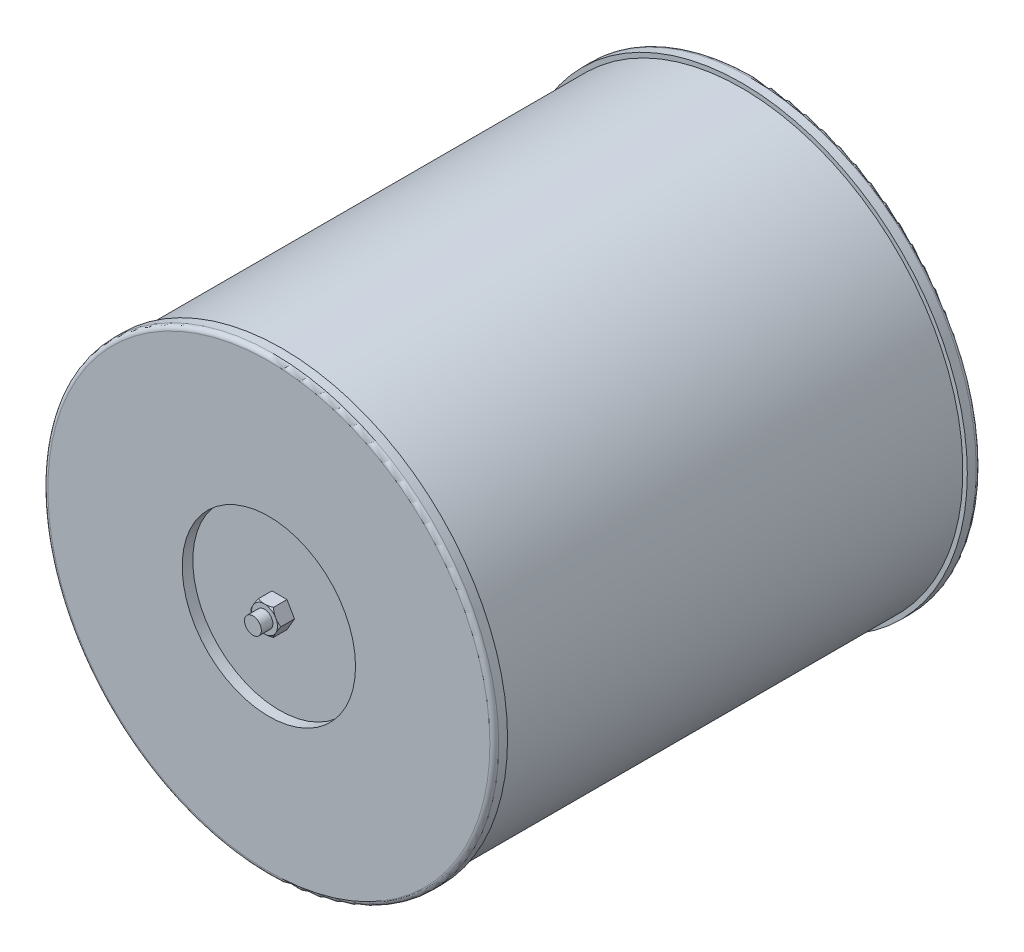
ISO-10303-21;
HEADER;
FILE_DESCRIPTION(('STEP AP214'),'2;1');
FILE_NAME('part.step','',(''),(''),'','','');
FILE_SCHEMA(('AUTOMOTIVE_DESIGN { 1 0 10303 214 1 1 1 1 }'));
ENDSEC;
DATA;
#1=APPLICATION_CONTEXT('core data for automotive mechanical design processes');
#2=APPLICATION_PROTOCOL_DEFINITION('international standard','automotive_design',2000,#1);
#3=PRODUCT_CONTEXT('',#1,'mechanical');
#4=PRODUCT('Part','Part','',(#3));
#5=PRODUCT_RELATED_PRODUCT_CATEGORY('part','',(#4));
#6=PRODUCT_DEFINITION_FORMATION('','',#4);
#7=PRODUCT_DEFINITION_CONTEXT('part definition',#1,'design');
#8=PRODUCT_DEFINITION('design','',#6,#7);
#9=PRODUCT_DEFINITION_SHAPE('','',#8);
#10=(LENGTH_UNIT() NAMED_UNIT(*) SI_UNIT(.MILLI.,.METRE.));
#11=(NAMED_UNIT(*) PLANE_ANGLE_UNIT() SI_UNIT($,.RADIAN.));
#12=(NAMED_UNIT(*) SI_UNIT($,.STERADIAN.) SOLID_ANGLE_UNIT());
#13=UNCERTAINTY_MEASURE_WITH_UNIT(LENGTH_MEASURE(1.E-05),#10,'distance_accuracy_value','');
#14=(GEOMETRIC_REPRESENTATION_CONTEXT(3) GLOBAL_UNCERTAINTY_ASSIGNED_CONTEXT((#13)) GLOBAL_UNIT_ASSIGNED_CONTEXT((#10,
#11,#12)) REPRESENTATION_CONTEXT('',''));
#15=CARTESIAN_POINT('',(0.,0.,0.));
#16=DIRECTION('',(0.,0.,1.));
#17=DIRECTION('',(1.,0.,0.));
#18=AXIS2_PLACEMENT_3D('',#15,#16,#17);
#19=CARTESIAN_POINT('',(8.50000000000001,-14.7224318643355,609.));
#20=DIRECTION('',(-0.866025403784439,0.5,0.));
#21=DIRECTION('',(-0.499999999999999,-0.866025403784439,0.));
#22=AXIS2_PLACEMENT_3D('',#19,#20,#21);
#23=PLANE('',#22);
#24=CARTESIAN_POINT('',(8.49988452994618,-14.7226318643354,607.405148768796));
#25=CARTESIAN_POINT('',(8.69039315339857,-14.3926612492359,607.538528078306));
#26=CARTESIAN_POINT('',(8.88197872797196,-14.0608253000775,607.665973161839));
#27=CARTESIAN_POINT('',(9.26741468428745,-13.3932306406752,607.907099881498));
#28=CARTESIAN_POINT('',(9.46126627069463,-13.0574698438901,608.020773794171));
#29=CARTESIAN_POINT('',(9.85186136665938,-12.3809392924919,608.23270536365));
#30=CARTESIAN_POINT('',(10.0486129794848,-12.0401555026071,608.330903784984));
#31=CARTESIAN_POINT('',(10.4441444233978,-11.3550749457588,608.50925772272));
#32=CARTESIAN_POINT('',(10.6429240515084,-11.0107785303615,608.589415026629));
#33=CARTESIAN_POINT('',(11.0349873130691,-10.3317050415573,608.727132985273));
#34=CARTESIAN_POINT('',(11.2282076130117,-9.99703766500307,608.785409976454));
#35=CARTESIAN_POINT('',(11.6159188345111,-9.32550213070143,608.881799403411));
#36=CARTESIAN_POINT('',(11.8104097925296,-8.98863390980069,608.919911257952));
#37=CARTESIAN_POINT('',(12.199764497399,-8.31425177880092,608.974793063536));
#38=CARTESIAN_POINT('',(12.394626759811,-7.97674043982547,608.991604821692));
#39=CARTESIAN_POINT('',(12.7845113443063,-7.30144053039164,609.003499284912));
#40=CARTESIAN_POINT('',(12.979533656718,-6.96365197668512,608.998583218363));
#41=CARTESIAN_POINT('',(13.335009283585,-6.34795013009896,608.969939979413));
#42=CARTESIAN_POINT('',(13.4955349150315,-6.06991158051661,608.94965816688));
#43=CARTESIAN_POINT('',(13.8159773569244,-5.51488899025665,608.894854416038));
#44=CARTESIAN_POINT('',(13.9758941630647,-5.23790495703756,608.860332377197));
#45=CARTESIAN_POINT('',(14.2950605863275,-4.68509249587628,608.77766637184));
#46=CARTESIAN_POINT('',(14.4543090023715,-4.40926614826329,608.729503968899));
#47=CARTESIAN_POINT('',(14.7717049987987,-3.8595201563324,608.620451341613));
#48=CARTESIAN_POINT('',(14.9298525804082,-3.58560050989061,608.559561131448));
#49=CARTESIAN_POINT('',(15.4122741629316,-2.75002181829227,608.35510047595));
#50=CARTESIAN_POINT('',(15.7345239044354,-2.19186889328173,608.192421560918));
#51=CARTESIAN_POINT('',(16.3722585844663,-1.08728002571959,607.826734515382));
#52=CARTESIAN_POINT('',(16.6877608145274,-0.540814133352436,607.623847960534));
#53=CARTESIAN_POINT('',(17.0001154700538,0.00019999999999136,607.405148768796));
#54=B_SPLINE_CURVE_WITH_KNOTS('',3,(#24,#25,#26,#27,#28,#29,#30,#31,#32,#33,#34,#35,#36,#37,#38,
#39,#40,#41,#42,#43,#44,#45,#46,#47,#48,#49,#50,#51,#52,#53),.UNSPECIFIED.,.F.,.F.,(4,2,2,2,2,2,
2,2,2,2,2,2,2,2,4),(0.,1.21112336899926,2.4229228728972,3.63925366135455,4.85546388306721,
6.02740233763067,7.19937457004229,8.36904291301571,9.5386451294341,10.5034039388739,
11.4681695593594,12.4342454393922,13.4003202431355,15.3928483128107,17.3794410640119),.UNSPECIFIED.);
#55=CARTESIAN_POINT('',(8.5,-14.7224318643355,607.405229622622));
#56=VERTEX_POINT('',#55);
#57=CARTESIAN_POINT('',(12.75,-7.36121593216772,609.));
#58=VERTEX_POINT('',#57);
#59=EDGE_CURVE('E175',#56,#58,#54,.T.);
#60=ORIENTED_EDGE('',*,*,#59,.F.);
#61=DIRECTION('',(0.,0.,-1.));
#62=VECTOR('',#61,1.);
#63=CARTESIAN_POINT('',(8.50000000000001,-14.7224318643355,609.));
#64=LINE('',#63,#62);
#65=CARTESIAN_POINT('',(8.50000000000001,-14.7224318643355,592.));
#66=VERTEX_POINT('',#65);
#67=EDGE_CURVE('E194',#56,#66,#64,.T.);
#68=ORIENTED_EDGE('',*,*,#67,.T.);
#69=DIRECTION('',(0.5,0.866025403784439,0.));
#70=VECTOR('',#69,1.);
#71=CARTESIAN_POINT('',(8.50000000000001,-14.7224318643355,592.));
#72=LINE('',#71,#70);
#73=CARTESIAN_POINT('',(17.,0.,592.));
#74=VERTEX_POINT('',#73);
#75=EDGE_CURVE('E177',#66,#74,#72,.T.);
#76=ORIENTED_EDGE('',*,*,#75,.T.);
#77=DIRECTION('',(0.,0.,-1.));
#78=VECTOR('',#77,1.);
#79=CARTESIAN_POINT('',(17.,0.,609.));
#80=LINE('',#79,#78);
#81=CARTESIAN_POINT('',(17.,0.,607.405229622622));
#82=VERTEX_POINT('',#81);
#83=EDGE_CURVE('E203',#82,#74,#80,.T.);
#84=ORIENTED_EDGE('',*,*,#83,.F.);
#85=EDGE_CURVE('E170',#58,#82,#54,.T.);
#86=ORIENTED_EDGE('',*,*,#85,.F.);
#87=EDGE_LOOP('',(#60,#68,#76,#84,#86));
#88=FACE_BOUND('',#87,.T.);
#89=ADVANCED_FACE('F36',(#88),#23,.F.);
#90=CARTESIAN_POINT('',(17.,0.,609.));
#91=DIRECTION('',(-0.866025403784439,-0.5,0.));
#92=DIRECTION('',(0.5,-0.866025403784439,0.));
#93=AXIS2_PLACEMENT_3D('',#90,#91,#92);
#94=PLANE('',#93);
#95=CARTESIAN_POINT('',(17.0001154700538,-0.000199999999986366,607.405148768796));
#96=CARTESIAN_POINT('',(16.8096068466014,0.329770615099569,607.538528078306));
#97=CARTESIAN_POINT('',(16.618021272028,0.661606564257958,607.665973161839));
#98=CARTESIAN_POINT('',(16.2325853157126,1.32920122366027,607.907099881498));
#99=CARTESIAN_POINT('',(16.0387337293054,1.66496202044535,608.020773794171));
#100=CARTESIAN_POINT('',(15.6481386333406,2.34149257184354,608.23270536365));
#101=CARTESIAN_POINT('',(15.4513870205152,2.68227636172834,608.330903784984));
#102=CARTESIAN_POINT('',(15.0558555766022,3.36735691857669,608.50925772272));
#103=CARTESIAN_POINT('',(14.8570759484916,3.71165333397395,608.589415026629));
#104=CARTESIAN_POINT('',(14.4650126869309,4.39072682277815,608.727132985273));
#105=CARTESIAN_POINT('',(14.2717923869883,4.72539419933239,608.785409976454));
#106=CARTESIAN_POINT('',(13.8840811654889,5.39692973363403,608.881799403411));
#107=CARTESIAN_POINT('',(13.6895902074704,5.73379795453477,608.919911257952));
#108=CARTESIAN_POINT('',(13.300235502601,6.40818008553453,608.974793063536));
#109=CARTESIAN_POINT('',(13.105373240189,6.74569142450999,608.991604821692));
#110=CARTESIAN_POINT('',(12.7154886556937,7.42099133394382,609.003499284912));
#111=CARTESIAN_POINT('',(12.520466343282,7.75877988765034,608.998583218363));
#112=CARTESIAN_POINT('',(12.164990716415,8.3744817342365,608.969939979413));
#113=CARTESIAN_POINT('',(12.0044650849685,8.65252028381885,608.94965816688));
#114=CARTESIAN_POINT('',(11.6840226430756,9.20754287407881,608.894854416038));
#115=CARTESIAN_POINT('',(11.5241058369353,9.4845269072979,608.860332377197));
#116=CARTESIAN_POINT('',(11.2049394136725,10.0373393684592,608.77766637184));
#117=CARTESIAN_POINT('',(11.0456909976285,10.3131657160722,608.729503968899));
#118=CARTESIAN_POINT('',(10.7282950012013,10.8629117080031,608.620451341613));
#119=CARTESIAN_POINT('',(10.5701474195918,11.1368313544448,608.559561131448));
#120=CARTESIAN_POINT('',(10.0877258370684,11.9724100460432,608.35510047595));
#121=CARTESIAN_POINT('',(9.76547609556457,12.5305629710537,608.192421560918));
#122=CARTESIAN_POINT('',(9.12774141553371,13.6351518386159,607.826734515382));
#123=CARTESIAN_POINT('',(8.81223918547258,14.181617730983,607.623847960534));
#124=CARTESIAN_POINT('',(8.49988452994617,14.7226318643354,607.405148768796));
#125=B_SPLINE_CURVE_WITH_KNOTS('',3,(#95,#96,#97,#98,#99,#100,#101,#102,#103,#104,#105,#106,
#107,#108,#109,#110,#111,#112,#113,#114,#115,#116,#117,#118,#119,#120,#121,#122,#123,#124),
.UNSPECIFIED.,.F.,.F.,(4,2,2,2,2,2,2,2,2,2,2,2,2,2,4),(0.,1.21112336899925,2.4229228728972,
3.63925366135454,4.85546388306722,6.02740233763067,7.1993745700423,8.36904291301572,
9.5386451294341,10.5034039388739,11.4681695593594,12.4342454393922,13.4003202431355,
15.3928483128107,17.3794410640119),.UNSPECIFIED.);
#126=CARTESIAN_POINT('',(12.75,7.36121593216773,609.));
#127=VERTEX_POINT('',#126);
#128=EDGE_CURVE('E176',#82,#127,#125,.T.);
#129=ORIENTED_EDGE('',*,*,#128,.F.);
#130=ORIENTED_EDGE('',*,*,#83,.T.);
#131=DIRECTION('',(-0.5,0.866025403784439,0.));
#132=VECTOR('',#131,1.);
#133=CARTESIAN_POINT('',(17.,0.,592.));
#134=LINE('',#133,#132);
#135=CARTESIAN_POINT('',(8.49999999999999,14.7224318643355,592.));
#136=VERTEX_POINT('',#135);
#137=EDGE_CURVE('E180',#74,#136,#134,.T.);
#138=ORIENTED_EDGE('',*,*,#137,.T.);
#139=DIRECTION('',(0.,0.,-1.));
#140=VECTOR('',#139,1.);
#141=CARTESIAN_POINT('',(8.49999999999999,14.7224318643355,609.));
#142=LINE('',#141,#140);
#143=CARTESIAN_POINT('',(8.49999999999999,14.7224318643355,607.405229622622));
#144=VERTEX_POINT('',#143);
#145=EDGE_CURVE('E201',#144,#136,#142,.T.);
#146=ORIENTED_EDGE('',*,*,#145,.F.);
#147=EDGE_CURVE('E112',#127,#144,#125,.T.);
#148=ORIENTED_EDGE('',*,*,#147,.F.);
#149=EDGE_LOOP('',(#129,#130,#138,#146,#148));
#150=FACE_BOUND('',#149,.T.);
#151=ADVANCED_FACE('F157',(#150),#94,.F.);
#152=CARTESIAN_POINT('',(8.49999999999999,14.7224318643355,609.));
#153=DIRECTION('',(0.,-1.,0.));
#154=DIRECTION('',(0.,0.,-1.));
#155=AXIS2_PLACEMENT_3D('',#152,#153,#154);
#156=PLANE('',#155);
#157=CARTESIAN_POINT('',(-21.9070210111892,14.7224318643355,600.827157238151));
#158=CARTESIAN_POINT('',(-21.6131727866534,14.7224318643355,600.997927517208));
#159=CARTESIAN_POINT('',(-21.318863318806,14.7224318643355,601.167903719336));
#160=CARTESIAN_POINT('',(-20.7292299907102,14.7224318643355,601.506095188901));
#161=CARTESIAN_POINT('',(-20.4339061185637,14.7224318643355,601.674310435588));
#162=CARTESIAN_POINT('',(-19.5461844928112,14.7224318643355,602.176106613007));
#163=CARTESIAN_POINT('',(-18.9521369108996,14.7224318643355,602.506779606306));
#164=CARTESIAN_POINT('',(-17.7550552073183,14.7224318643355,603.160647982128));
#165=CARTESIAN_POINT('',(-17.1519880293089,14.7224318643355,603.483782984033));
#166=CARTESIAN_POINT('',(-15.9395723851807,14.7224318643355,604.11800530778));
#167=CARTESIAN_POINT('',(-15.3302242642296,14.7224318643355,604.42909328724));
#168=CARTESIAN_POINT('',(-14.0755322882342,14.7224318643355,605.050212070241));
#169=CARTESIAN_POINT('',(-13.4298305136152,14.7224318643355,605.35952350719));
#170=CARTESIAN_POINT('',(-12.1284659310276,14.7224318643355,605.956842501091));
#171=CARTESIAN_POINT('',(-11.4728017643619,14.7224318643355,606.244847120151));
#172=CARTESIAN_POINT('',(-10.1514300595599,14.7224318643355,606.792491357637));
#173=CARTESIAN_POINT('',(-9.48574939175835,14.7224318643355,607.05219531669));
#174=CARTESIAN_POINT('',(-8.14148781537718,14.7224318643355,607.535655394813));
#175=CARTESIAN_POINT('',(-7.46291185547492,14.7224318643355,607.759425004429));
#176=CARTESIAN_POINT('',(-6.4236584837169,14.7224318643355,608.063717145651));
#177=CARTESIAN_POINT('',(-6.06792147136555,14.7224318643355,608.161185894189));
#178=CARTESIAN_POINT('',(-5.35291099466609,14.7224318643355,608.342234500884));
#179=CARTESIAN_POINT('',(-4.99363761588046,14.7224318643355,608.425814694204));
#180=CARTESIAN_POINT('',(-4.2718769499805,14.7224318643355,608.577509277395));
#181=CARTESIAN_POINT('',(-3.9093901388392,14.7224318643355,608.645625919228));
#182=CARTESIAN_POINT('',(-3.18164622082726,14.7224318643355,608.764930163968));
#183=CARTESIAN_POINT('',(-2.81638931073516,14.7224318643355,608.816118958059));
#184=CARTESIAN_POINT('',(-2.09040362575412,14.7224318643355,608.899567367009));
#185=CARTESIAN_POINT('',(-1.7297125491383,14.7224318643355,608.932152821613));
#186=CARTESIAN_POINT('',(-1.00713779208381,14.7224318643355,608.978977347973));
#187=CARTESIAN_POINT('',(-0.645254131987884,14.7224318643355,608.993216731064));
#188=CARTESIAN_POINT('',(0.0787954900087204,14.7224318643355,609.002968366179));
#189=CARTESIAN_POINT('',(0.440961471176997,14.7224318643355,608.998479202854));
#190=CARTESIAN_POINT('',(1.16458401773485,14.7224318643355,608.970893405408));
#191=CARTESIAN_POINT('',(1.52604056594327,14.7224318643355,608.947796326078));
#192=CARTESIAN_POINT('',(2.28346120134324,14.7224318643355,608.880381412217));
#193=CARTESIAN_POINT('',(2.67925666150085,14.7224318643355,608.834170360106));
#194=CARTESIAN_POINT('',(3.46791210664819,14.7224318643355,608.72132027488));
#195=CARTESIAN_POINT('',(3.86077196121831,14.7224318643355,608.654680339638));
#196=CARTESIAN_POINT('',(4.64294545965385,14.7224318643355,608.502722575705));
#197=CARTESIAN_POINT('',(5.03225811766687,14.7224318643355,608.417399710151));
#198=CARTESIAN_POINT('',(5.80684730430625,14.7224318643355,608.23003778663));
#199=CARTESIAN_POINT('',(6.19212347737798,14.7224318643355,608.127997269039));
#200=CARTESIAN_POINT('',(6.96842620062364,14.7224318643355,607.906332708945));
#201=CARTESIAN_POINT('',(7.35934114792461,14.7224318643355,607.786319902694));
#202=CARTESIAN_POINT('',(8.13675289817688,14.7224318643355,607.532807201728));
#203=CARTESIAN_POINT('',(8.52324964974701,14.7224318643355,607.399307150341));
#204=CARTESIAN_POINT('',(9.29194646521159,14.7224318643355,607.12067799576));
#205=CARTESIAN_POINT('',(9.67414719474979,14.7224318643355,606.975550723268));
#206=CARTESIAN_POINT('',(10.2444482609179,14.7224318643355,606.750342740595));
#207=CARTESIAN_POINT('',(10.4340455736767,14.7224318643355,606.674021860731));
#208=CARTESIAN_POINT('',(10.8122862522786,14.7224318643355,606.519049416296));
#209=CARTESIAN_POINT('',(11.0009296152692,14.7224318643355,606.44039784476));
#210=CARTESIAN_POINT('',(11.5911488439318,14.7224318643355,606.190332549858));
#211=CARTESIAN_POINT('',(11.9910981036188,14.7224318643355,606.015070215827));
#212=CARTESIAN_POINT('',(12.7872188118693,14.7224318643355,605.65614302133));
#213=CARTESIAN_POINT('',(13.1833900404776,14.7224318643355,605.47247767521));
#214=CARTESIAN_POINT('',(13.9723970870186,14.7224318643355,605.097929938689));
#215=CARTESIAN_POINT('',(14.36523222616,14.7224318643355,604.907046120688));
#216=CARTESIAN_POINT('',(15.1478465895717,14.7224318643355,604.519105023319));
#217=CARTESIAN_POINT('',(15.5376257371777,14.7224318643355,604.322047589693));
#218=CARTESIAN_POINT('',(16.7035439736515,14.7224318643355,603.722587795248));
#219=CARTESIAN_POINT('',(17.4755909219293,14.7224318643355,603.312221037724));
#220=CARTESIAN_POINT('',(19.0108832810946,14.7224318643355,602.475619219642));
#221=CARTESIAN_POINT('',(19.7741295390246,14.7224318643355,602.049385703199));
#222=CARTESIAN_POINT('',(21.2963827080382,14.7224318643355,601.183136706846));
#223=CARTESIAN_POINT('',(22.0553644842728,14.7224318643355,600.743077156186));
#224=CARTESIAN_POINT('',(23.5676803973077,14.7224318643355,599.853348150151));
#225=CARTESIAN_POINT('',(24.3210144208875,14.7224318643355,599.403678502813));
#226=CARTESIAN_POINT('',(25.8227004502809,14.7224318643355,598.496951478436));
#227=CARTESIAN_POINT('',(26.5710547653902,14.7224318643355,598.039897919953));
#228=CARTESIAN_POINT('',(28.0639796266969,14.7224318643355,597.119672483518));
#229=CARTESIAN_POINT('',(28.8085502015156,14.7224318643355,596.656500651943));
#230=CARTESIAN_POINT('',(30.1896859064894,14.7224318643355,595.790890556864));
#231=CARTESIAN_POINT('',(30.8266620800157,14.7224318643355,595.389107401652));
#232=CARTESIAN_POINT('',(32.0986308908679,14.7224318643355,594.582412274773));
#233=CARTESIAN_POINT('',(32.7336235239392,14.7224318643355,594.177500296401));
#234=CARTESIAN_POINT('',(34.6362186245199,14.7224318643355,592.958667726216));
#235=CARTESIAN_POINT('',(35.9012661746235,14.7224318643355,592.14075873712));
#236=CARTESIAN_POINT('',(38.4173371482943,14.7224318643355,590.502817976054));
#237=CARTESIAN_POINT('',(39.6683966492935,14.7224318643355,589.682841521474));
#238=CARTESIAN_POINT('',(41.5419190908656,14.7224318643355,588.448453509564));
#239=CARTESIAN_POINT('',(42.1658636070736,14.7224318643355,588.03628812311));
#240=CARTESIAN_POINT('',(43.4128706303985,14.7224318643355,587.210627973746));
#241=CARTESIAN_POINT('',(44.0359331393765,14.7224318643355,586.797133213647));
#242=CARTESIAN_POINT('',(44.6586085977754,14.7224318643355,586.383056598177));
#243=B_SPLINE_CURVE_WITH_KNOTS('',3,(#157,#158,#159,#160,#161,#162,#163,#164,#165,#166,#167,
#168,#169,#170,#171,#172,#173,#174,#175,#176,#177,#178,#179,#180,#181,#182,#183,#184,#185,#186,
#187,#188,#189,#190,#191,#192,#193,#194,#195,#196,#197,#198,#199,#200,#201,#202,#203,#204,#205,
#206,#207,#208,#209,#210,#211,#212,#213,#214,#215,#216,#217,#218,#219,#220,#221,#222,#223,#224,
#225,#226,#227,#228,#229,#230,#231,#232,#233,#234,#235,#236,#237,#238,#239,#240,#241,#242),
.UNSPECIFIED.,.F.,.F.,(4,2,2,2,2,2,2,2,2,2,2,2,2,2,2,2,2,2,2,2,2,2,2,2,2,2,2,2,2,2,2,2,2,2,2,2,
2,2,2,2,2,2,4),(0.,1.01959733270981,2.03920666556656,4.07877314987932,6.13121468751881,
8.18354402880037,10.3311394136426,12.479030370088,14.621931545588,16.764026338541,
17.8703415672107,18.9766300940286,20.0827574080213,21.1888068690043,22.2748373812835,
23.3608494632798,24.4469436185817,25.5330637602817,26.7279341711776,27.9228573544683,
29.1181030830968,30.3134532246729,31.5399381327046,32.766437289599,33.9927437126559,
34.6058771192016,35.2190123580937,36.5288807506824,37.8388249432345,39.1490295730838,
40.4592669669223,43.0819803519861,45.704439164852,48.3363338527296,50.9682811618536,
53.5989083756938,56.2295156609956,58.4888228850313,60.7481349518082,65.2673690327149,
69.7548420459555,71.9982049659942,74.2415631450415),.UNSPECIFIED.);
#244=CARTESIAN_POINT('',(0.,14.7224318643355,609.));
#245=VERTEX_POINT('',#244);
#246=EDGE_CURVE('E108',#144,#245,#243,.F.);
#247=ORIENTED_EDGE('',*,*,#246,.F.);
#248=ORIENTED_EDGE('',*,*,#145,.T.);
#249=DIRECTION('',(-1.,0.,0.));
#250=VECTOR('',#249,1.);
#251=CARTESIAN_POINT('',(8.49999999999999,14.7224318643355,592.));
#252=LINE('',#251,#250);
#253=CARTESIAN_POINT('',(-8.50000000000001,14.7224318643355,592.));
#254=VERTEX_POINT('',#253);
#255=EDGE_CURVE('E183',#136,#254,#252,.T.);
#256=ORIENTED_EDGE('',*,*,#255,.T.);
#257=DIRECTION('',(0.,0.,-1.));
#258=VECTOR('',#257,1.);
#259=CARTESIAN_POINT('',(-8.50000000000001,14.7224318643355,609.));
#260=LINE('',#259,#258);
#261=CARTESIAN_POINT('',(-8.50000000000001,14.7224318643355,607.405229622622));
#262=VERTEX_POINT('',#261);
#263=EDGE_CURVE('E132',#262,#254,#260,.T.);
#264=ORIENTED_EDGE('',*,*,#263,.F.);
#265=EDGE_CURVE('E116',#245,#262,#243,.F.);
#266=ORIENTED_EDGE('',*,*,#265,.F.);
#267=EDGE_LOOP('',(#247,#248,#256,#264,#266));
#268=FACE_BOUND('',#267,.T.);
#269=ADVANCED_FACE('F130',(#268),#156,.F.);
#270=CARTESIAN_POINT('',(-8.50000000000001,14.7224318643355,609.));
#271=DIRECTION('',(0.866025403784439,-0.5,0.));
#272=DIRECTION('',(0.5,0.866025403784439,0.));
#273=AXIS2_PLACEMENT_3D('',#270,#271,#272);
#274=PLANE('',#273);
#275=CARTESIAN_POINT('',(-8.49988452994618,14.7226318643354,607.405148768796));
#276=CARTESIAN_POINT('',(-8.69039315339857,14.3926612492359,607.538528078306));
#277=CARTESIAN_POINT('',(-8.88197872797196,14.0608253000775,607.665973161839));
#278=CARTESIAN_POINT('',(-9.26741468428745,13.3932306406752,607.907099881498));
#279=CARTESIAN_POINT('',(-9.46126627069463,13.0574698438901,608.020773794171));
#280=CARTESIAN_POINT('',(-9.85186136665939,12.3809392924919,608.23270536365));
#281=CARTESIAN_POINT('',(-10.0486129794848,12.0401555026071,608.330903784984));
#282=CARTESIAN_POINT('',(-10.4441444233978,11.3550749457588,608.50925772272));
#283=CARTESIAN_POINT('',(-10.6429240515084,11.0107785303615,608.589415026629));
#284=CARTESIAN_POINT('',(-11.0349873130691,10.3317050415573,608.727132985273));
#285=CARTESIAN_POINT('',(-11.2282076130117,9.99703766500307,608.785409976454));
#286=CARTESIAN_POINT('',(-11.6159188345111,9.32550213070143,608.881799403411));
#287=CARTESIAN_POINT('',(-11.8104097925296,8.98863390980069,608.919911257952));
#288=CARTESIAN_POINT('',(-12.199764497399,8.31425177880092,608.974793063536));
#289=CARTESIAN_POINT('',(-12.394626759811,7.97674043982547,608.991604821692));
#290=CARTESIAN_POINT('',(-12.7845113443064,7.30144053039163,609.003499284912));
#291=CARTESIAN_POINT('',(-12.979533656718,6.96365197668512,608.998583218363));
#292=CARTESIAN_POINT('',(-13.3350092835851,6.34795013009896,608.969939979413));
#293=CARTESIAN_POINT('',(-13.4955349150315,6.06991158051661,608.94965816688));
#294=CARTESIAN_POINT('',(-13.8159773569244,5.51488899025664,608.894854416038));
#295=CARTESIAN_POINT('',(-13.9758941630647,5.23790495703755,608.860332377197));
#296=CARTESIAN_POINT('',(-14.2950605863275,4.68509249587627,608.77766637184));
#297=CARTESIAN_POINT('',(-14.4543090023715,4.40926614826328,608.729503968899));
#298=CARTESIAN_POINT('',(-14.7717049987987,3.8595201563324,608.620451341613));
#299=CARTESIAN_POINT('',(-14.9298525804082,3.58560050989062,608.559561131448));
#300=CARTESIAN_POINT('',(-15.4122741629316,2.75002181829228,608.35510047595));
#301=CARTESIAN_POINT('',(-15.7345239044354,2.19186889328174,608.192421560918));
#302=CARTESIAN_POINT('',(-16.3722585844663,1.0872800257196,607.826734515382));
#303=CARTESIAN_POINT('',(-16.6877608145274,0.540814133352439,607.623847960534));
#304=CARTESIAN_POINT('',(-17.0001154700538,-0.000199999999989274,607.405148768796));
#305=B_SPLINE_CURVE_WITH_KNOTS('',3,(#275,#276,#277,#278,#279,#280,#281,#282,#283,#284,#285,
#286,#287,#288,#289,#290,#291,#292,#293,#294,#295,#296,#297,#298,#299,#300,#301,#302,#303,#304),
.UNSPECIFIED.,.F.,.F.,(4,2,2,2,2,2,2,2,2,2,2,2,2,2,4),(0.,1.21112336899926,2.4229228728972,
3.63925366135455,4.85546388306722,6.02740233763067,7.1993745700423,8.36904291301572,
9.53864512943411,10.5034039388739,11.4681695593595,12.4342454393922,13.4003202431355,
15.3928483128107,17.3794410640119),.UNSPECIFIED.);
#306=CARTESIAN_POINT('',(-12.75,7.36121593216773,609.));
#307=VERTEX_POINT('',#306);
#308=EDGE_CURVE('E121',#262,#307,#305,.T.);
#309=ORIENTED_EDGE('',*,*,#308,.F.);
#310=ORIENTED_EDGE('',*,*,#263,.T.);
#311=DIRECTION('',(-0.5,-0.866025403784439,0.));
#312=VECTOR('',#311,1.);
#313=CARTESIAN_POINT('',(-8.50000000000001,14.7224318643355,592.));
#314=LINE('',#313,#312);
#315=CARTESIAN_POINT('',(-17.,0.,592.));
#316=VERTEX_POINT('',#315);
#317=EDGE_CURVE('E185',#254,#316,#314,.T.);
#318=ORIENTED_EDGE('',*,*,#317,.T.);
#319=DIRECTION('',(0.,0.,-1.));
#320=VECTOR('',#319,1.);
#321=CARTESIAN_POINT('',(-17.,0.,609.));
#322=LINE('',#321,#320);
#323=CARTESIAN_POINT('',(-17.,0.,607.405229622622));
#324=VERTEX_POINT('',#323);
#325=EDGE_CURVE('E198',#324,#316,#322,.T.);
#326=ORIENTED_EDGE('',*,*,#325,.F.);
#327=EDGE_CURVE('E133',#307,#324,#305,.T.);
#328=ORIENTED_EDGE('',*,*,#327,.F.);
#329=EDGE_LOOP('',(#309,#310,#318,#326,#328));
#330=FACE_BOUND('',#329,.T.);
#331=ADVANCED_FACE('F156',(#330),#274,.F.);
#332=CARTESIAN_POINT('',(-17.,0.,609.));
#333=DIRECTION('',(0.866025403784439,0.5,0.));
#334=DIRECTION('',(-0.5,0.866025403784439,0.));
#335=AXIS2_PLACEMENT_3D('',#332,#333,#334);
#336=PLANE('',#335);
#337=CARTESIAN_POINT('',(-17.0001154700538,0.000199999999985079,607.405148768796));
#338=CARTESIAN_POINT('',(-16.8096068466014,-0.329770615099572,607.538528078306));
#339=CARTESIAN_POINT('',(-16.618021272028,-0.661606564257962,607.665973161839));
#340=CARTESIAN_POINT('',(-16.2325853157126,-1.32920122366028,607.907099881498));
#341=CARTESIAN_POINT('',(-16.0387337293054,-1.66496202044535,608.020773794171));
#342=CARTESIAN_POINT('',(-15.6481386333406,-2.34149257184355,608.23270536365));
#343=CARTESIAN_POINT('',(-15.4513870205152,-2.68227636172834,608.330903784984));
#344=CARTESIAN_POINT('',(-15.0558555766022,-3.3673569185767,608.50925772272));
#345=CARTESIAN_POINT('',(-14.8570759484916,-3.71165333397395,608.589415026629));
#346=CARTESIAN_POINT('',(-14.4650126869309,-4.39072682277815,608.727132985273));
#347=CARTESIAN_POINT('',(-14.2717923869884,-4.7253941993324,608.785409976454));
#348=CARTESIAN_POINT('',(-13.8840811654889,-5.39692973363403,608.881799403411));
#349=CARTESIAN_POINT('',(-13.6895902074704,-5.73379795453477,608.919911257952));
#350=CARTESIAN_POINT('',(-13.300235502601,-6.40818008553454,608.974793063536));
#351=CARTESIAN_POINT('',(-13.105373240189,-6.74569142450999,608.991604821692));
#352=CARTESIAN_POINT('',(-12.7154886556937,-7.42099133394383,609.003499284912));
#353=CARTESIAN_POINT('',(-12.520466343282,-7.75877988765034,608.998583218363));
#354=CARTESIAN_POINT('',(-12.164990716415,-8.3744817342365,608.969939979413));
#355=CARTESIAN_POINT('',(-12.0044650849685,-8.65252028381886,608.94965816688));
#356=CARTESIAN_POINT('',(-11.6840226430756,-9.20754287407882,608.894854416038));
#357=CARTESIAN_POINT('',(-11.5241058369353,-9.48452690729791,608.860332377197));
#358=CARTESIAN_POINT('',(-11.2049394136725,-10.0373393684592,608.77766637184));
#359=CARTESIAN_POINT('',(-11.0456909976285,-10.3131657160722,608.729503968899));
#360=CARTESIAN_POINT('',(-10.7282950012013,-10.8629117080031,608.620451341613));
#361=CARTESIAN_POINT('',(-10.5701474195918,-11.1368313544448,608.559561131448));
#362=CARTESIAN_POINT('',(-10.0877258370684,-11.9724100460432,608.35510047595));
#363=CARTESIAN_POINT('',(-9.76547609556458,-12.5305629710537,608.192421560918));
#364=CARTESIAN_POINT('',(-9.12774141553372,-13.6351518386159,607.826734515382));
#365=CARTESIAN_POINT('',(-8.81223918547259,-14.181617730983,607.623847960534));
#366=CARTESIAN_POINT('',(-8.49988452994617,-14.7226318643354,607.405148768796));
#367=B_SPLINE_CURVE_WITH_KNOTS('',3,(#337,#338,#339,#340,#341,#342,#343,#344,#345,#346,#347,
#348,#349,#350,#351,#352,#353,#354,#355,#356,#357,#358,#359,#360,#361,#362,#363,#364,#365,#366),
.UNSPECIFIED.,.F.,.F.,(4,2,2,2,2,2,2,2,2,2,2,2,2,2,4),(0.,1.21112336899926,2.4229228728972,
3.63925366135455,4.85546388306722,6.02740233763067,7.1993745700423,8.36904291301572,
9.53864512943411,10.5034039388739,11.4681695593595,12.4342454393922,13.4003202431355,
15.3928483128107,17.3794410640119),.UNSPECIFIED.);
#368=CARTESIAN_POINT('',(-12.75,-7.36121593216773,609.));
#369=VERTEX_POINT('',#368);
#370=EDGE_CURVE('E277',#324,#369,#367,.T.);
#371=ORIENTED_EDGE('',*,*,#370,.F.);
#372=ORIENTED_EDGE('',*,*,#325,.T.);
#373=DIRECTION('',(0.5,-0.866025403784439,0.));
#374=VECTOR('',#373,1.);
#375=CARTESIAN_POINT('',(-17.,0.,592.));
#376=LINE('',#375,#374);
#377=CARTESIAN_POINT('',(-8.5,-14.7224318643355,592.));
#378=VERTEX_POINT('',#377);
#379=EDGE_CURVE('E188',#316,#378,#376,.T.);
#380=ORIENTED_EDGE('',*,*,#379,.T.);
#381=DIRECTION('',(0.,0.,-1.));
#382=VECTOR('',#381,1.);
#383=CARTESIAN_POINT('',(-8.5,-14.7224318643355,609.));
#384=LINE('',#383,#382);
#385=CARTESIAN_POINT('',(-8.5,-14.7224318643355,607.405229622622));
#386=VERTEX_POINT('',#385);
#387=EDGE_CURVE('E196',#386,#378,#384,.T.);
#388=ORIENTED_EDGE('',*,*,#387,.F.);
#389=EDGE_CURVE('E273',#369,#386,#367,.T.);
#390=ORIENTED_EDGE('',*,*,#389,.F.);
#391=EDGE_LOOP('',(#371,#372,#380,#388,#390));
#392=FACE_BOUND('',#391,.T.);
#393=ADVANCED_FACE('F265',(#392),#336,.F.);
#394=CARTESIAN_POINT('',(-8.5,-14.7224318643355,609.));
#395=DIRECTION('',(0.,1.,0.));
#396=DIRECTION('',(-1.,0.,0.));
#397=AXIS2_PLACEMENT_3D('',#394,#395,#396);
#398=PLANE('',#397);
#399=CARTESIAN_POINT('',(-21.9070210111892,-14.7224318643355,600.827157238151));
#400=CARTESIAN_POINT('',(-21.6131727866534,-14.7224318643355,600.997927517208));
#401=CARTESIAN_POINT('',(-21.3188633188059,-14.7224318643355,601.167903719336));
#402=CARTESIAN_POINT('',(-20.7292299907102,-14.7224318643355,601.506095188901));
#403=CARTESIAN_POINT('',(-20.4339061185637,-14.7224318643355,601.674310435588));
#404=CARTESIAN_POINT('',(-19.5461844928112,-14.7224318643355,602.176106613007));
#405=CARTESIAN_POINT('',(-18.9521369108995,-14.7224318643355,602.506779606306));
#406=CARTESIAN_POINT('',(-17.7550552073182,-14.7224318643355,603.160647982128));
#407=CARTESIAN_POINT('',(-17.1519880293089,-14.7224318643355,603.483782984033));
#408=CARTESIAN_POINT('',(-15.9395723851807,-14.7224318643355,604.11800530778));
#409=CARTESIAN_POINT('',(-15.3302242642295,-14.7224318643355,604.42909328724));
#410=CARTESIAN_POINT('',(-14.0755322882342,-14.7224318643355,605.050212070241));
#411=CARTESIAN_POINT('',(-13.4298305136152,-14.7224318643355,605.35952350719));
#412=CARTESIAN_POINT('',(-12.1284659310276,-14.7224318643355,605.956842501091));
#413=CARTESIAN_POINT('',(-11.4728017643619,-14.7224318643355,606.244847120151));
#414=CARTESIAN_POINT('',(-10.1514300595599,-14.7224318643355,606.792491357637));
#415=CARTESIAN_POINT('',(-9.48574939175835,-14.7224318643355,607.05219531669));
#416=CARTESIAN_POINT('',(-8.14148781537718,-14.7224318643355,607.535655394813));
#417=CARTESIAN_POINT('',(-7.46291185547492,-14.7224318643355,607.759425004429));
#418=CARTESIAN_POINT('',(-6.4236584837169,-14.7224318643355,608.063717145651));
#419=CARTESIAN_POINT('',(-6.06792147136556,-14.7224318643355,608.161185894189));
#420=CARTESIAN_POINT('',(-5.35291099466609,-14.7224318643355,608.342234500884));
#421=CARTESIAN_POINT('',(-4.99363761588046,-14.7224318643355,608.425814694204));
#422=CARTESIAN_POINT('',(-4.2718769499805,-14.7224318643355,608.577509277395));
#423=CARTESIAN_POINT('',(-3.90939013883921,-14.7224318643355,608.645625919228));
#424=CARTESIAN_POINT('',(-3.18164622082726,-14.7224318643355,608.764930163968));
#425=CARTESIAN_POINT('',(-2.81638931073516,-14.7224318643355,608.816118958059));
#426=CARTESIAN_POINT('',(-2.09040362575412,-14.7224318643355,608.899567367009));
#427=CARTESIAN_POINT('',(-1.7297125491383,-14.7224318643355,608.932152821613));
#428=CARTESIAN_POINT('',(-1.00713779208381,-14.7224318643355,608.978977347973));
#429=CARTESIAN_POINT('',(-0.645254131987883,-14.7224318643355,608.993216731064));
#430=CARTESIAN_POINT('',(0.0787954900087207,-14.7224318643355,609.002968366179));
#431=CARTESIAN_POINT('',(0.440961471176997,-14.7224318643355,608.998479202854));
#432=CARTESIAN_POINT('',(1.16458401773485,-14.7224318643355,608.970893405408));
#433=CARTESIAN_POINT('',(1.52604056594327,-14.7224318643355,608.947796326078));
#434=CARTESIAN_POINT('',(2.28346120134324,-14.7224318643355,608.880381412217));
#435=CARTESIAN_POINT('',(2.67925666150085,-14.7224318643355,608.834170360106));
#436=CARTESIAN_POINT('',(3.4679121066482,-14.7224318643355,608.72132027488));
#437=CARTESIAN_POINT('',(3.86077196121831,-14.7224318643355,608.654680339638));
#438=CARTESIAN_POINT('',(4.64294545965386,-14.7224318643355,608.502722575705));
#439=CARTESIAN_POINT('',(5.03225811766688,-14.7224318643355,608.417399710151));
#440=CARTESIAN_POINT('',(5.80684730430626,-14.7224318643355,608.23003778663));
#441=CARTESIAN_POINT('',(6.19212347737798,-14.7224318643355,608.127997269039));
#442=CARTESIAN_POINT('',(6.96842620062364,-14.7224318643355,607.906332708945));
#443=CARTESIAN_POINT('',(7.35934114792461,-14.7224318643355,607.786319902694));
#444=CARTESIAN_POINT('',(8.13675289817688,-14.7224318643355,607.532807201728));
#445=CARTESIAN_POINT('',(8.52324964974701,-14.7224318643355,607.399307150341));
#446=CARTESIAN_POINT('',(9.29194646521159,-14.7224318643355,607.12067799576));
#447=CARTESIAN_POINT('',(9.67414719474978,-14.7224318643355,606.975550723268));
#448=CARTESIAN_POINT('',(10.2444482609179,-14.7224318643355,606.750342740595));
#449=CARTESIAN_POINT('',(10.4340455736768,-14.7224318643355,606.674021860731));
#450=CARTESIAN_POINT('',(10.8122862522787,-14.7224318643355,606.519049416296));
#451=CARTESIAN_POINT('',(11.0009296152692,-14.7224318643355,606.44039784476));
#452=CARTESIAN_POINT('',(11.5911488439318,-14.7224318643355,606.190332549858));
#453=CARTESIAN_POINT('',(11.9910981036188,-14.7224318643355,606.015070215827));
#454=CARTESIAN_POINT('',(12.7872188118693,-14.7224318643355,605.65614302133));
#455=CARTESIAN_POINT('',(13.1833900404776,-14.7224318643355,605.47247767521));
#456=CARTESIAN_POINT('',(13.9723970870186,-14.7224318643355,605.097929938689));
#457=CARTESIAN_POINT('',(14.36523222616,-14.7224318643355,604.907046120688));
#458=CARTESIAN_POINT('',(15.1478465895717,-14.7224318643355,604.519105023319));
#459=CARTESIAN_POINT('',(15.5376257371777,-14.7224318643355,604.322047589693));
#460=CARTESIAN_POINT('',(16.7035439736514,-14.7224318643355,603.722587795247));
#461=CARTESIAN_POINT('',(17.4755909219293,-14.7224318643355,603.312221037724));
#462=CARTESIAN_POINT('',(19.0108832810947,-14.7224318643355,602.475619219642));
#463=CARTESIAN_POINT('',(19.7741295390246,-14.7224318643355,602.049385703199));
#464=CARTESIAN_POINT('',(21.2963827080382,-14.7224318643355,601.183136706846));
#465=CARTESIAN_POINT('',(22.0553644842728,-14.7224318643355,600.743077156186));
#466=CARTESIAN_POINT('',(23.5676803973077,-14.7224318643355,599.853348150151));
#467=CARTESIAN_POINT('',(24.3210144208875,-14.7224318643355,599.403678502814));
#468=CARTESIAN_POINT('',(25.8227004502809,-14.7224318643355,598.496951478436));
#469=CARTESIAN_POINT('',(26.5710547653902,-14.7224318643355,598.039897919953));
#470=CARTESIAN_POINT('',(28.0639796266968,-14.7224318643355,597.119672483518));
#471=CARTESIAN_POINT('',(28.8085502015156,-14.7224318643355,596.656500651943));
#472=CARTESIAN_POINT('',(30.1896859064894,-14.7224318643355,595.790890556864));
#473=CARTESIAN_POINT('',(30.8266620800157,-14.7224318643355,595.389107401652));
#474=CARTESIAN_POINT('',(32.0986308908678,-14.7224318643355,594.582412274773));
#475=CARTESIAN_POINT('',(32.7336235239391,-14.7224318643355,594.177500296401));
#476=CARTESIAN_POINT('',(34.6362186245199,-14.7224318643355,592.958667726216));
#477=CARTESIAN_POINT('',(35.9012661746235,-14.7224318643355,592.14075873712));
#478=CARTESIAN_POINT('',(38.4173371482944,-14.7224318643355,590.502817976054));
#479=CARTESIAN_POINT('',(39.6683966492935,-14.7224318643355,589.682841521474));
#480=CARTESIAN_POINT('',(41.5419190908656,-14.7224318643355,588.448453509564));
#481=CARTESIAN_POINT('',(42.1658636070736,-14.7224318643355,588.03628812311));
#482=CARTESIAN_POINT('',(43.4128706303985,-14.7224318643355,587.210627973746));
#483=CARTESIAN_POINT('',(44.0359331393765,-14.7224318643355,586.797133213647));
#484=CARTESIAN_POINT('',(44.6586085977754,-14.7224318643355,586.383056598177));
#485=B_SPLINE_CURVE_WITH_KNOTS('',3,(#399,#400,#401,#402,#403,#404,#405,#406,#407,#408,#409,
#410,#411,#412,#413,#414,#415,#416,#417,#418,#419,#420,#421,#422,#423,#424,#425,#426,#427,#428,
#429,#430,#431,#432,#433,#434,#435,#436,#437,#438,#439,#440,#441,#442,#443,#444,#445,#446,#447,
#448,#449,#450,#451,#452,#453,#454,#455,#456,#457,#458,#459,#460,#461,#462,#463,#464,#465,#466,
#467,#468,#469,#470,#471,#472,#473,#474,#475,#476,#477,#478,#479,#480,#481,#482,#483,#484),
.UNSPECIFIED.,.F.,.F.,(4,2,2,2,2,2,2,2,2,2,2,2,2,2,2,2,2,2,2,2,2,2,2,2,2,2,2,2,2,2,2,2,2,2,2,2,
2,2,2,2,2,2,4),(0.,1.01959733270982,2.03920666556659,4.07877314987938,6.13121468751883,
8.18354402880036,10.3311394136426,12.479030370088,14.6219315455879,16.764026338541,
17.8703415672107,18.9766300940286,20.0827574080212,21.1888068690043,22.2748373812835,
23.3608494632798,24.4469436185817,25.5330637602817,26.7279341711776,27.9228573544683,
29.1181030830968,30.3134532246729,31.5399381327046,32.766437289599,33.9927437126559,
34.6058771192016,35.2190123580937,36.5288807506824,37.8388249432345,39.1490295730838,
40.4592669669223,43.0819803519861,45.704439164852,48.3363338527295,50.9682811618535,
53.5989083756936,56.2295156609956,58.4888228850312,60.7481349518081,65.2673690327149,
69.7548420459555,71.9982049659942,74.2415631450416),.UNSPECIFIED.);
#486=CARTESIAN_POINT('',(0.,-14.7224318643355,609.));
#487=VERTEX_POINT('',#486);
#488=EDGE_CURVE('E272',#386,#487,#485,.T.);
#489=ORIENTED_EDGE('',*,*,#488,.F.);
#490=ORIENTED_EDGE('',*,*,#387,.T.);
#491=DIRECTION('',(1.,0.,0.));
#492=VECTOR('',#491,1.);
#493=CARTESIAN_POINT('',(-8.5,-14.7224318643355,592.));
#494=LINE('',#493,#492);
#495=EDGE_CURVE('E191',#378,#66,#494,.T.);
#496=ORIENTED_EDGE('',*,*,#495,.T.);
#497=ORIENTED_EDGE('',*,*,#67,.F.);
#498=EDGE_CURVE('E127',#487,#56,#485,.T.);
#499=ORIENTED_EDGE('',*,*,#498,.F.);
#500=EDGE_LOOP('',(#489,#490,#496,#497,#499));
#501=FACE_BOUND('',#500,.T.);
#502=ADVANCED_FACE('F261',(#501),#398,.F.);
#503=CARTESIAN_POINT('',(0.,0.,592.));
#504=DIRECTION('',(0.,0.,1.));
#505=DIRECTION('',(1.,0.,0.));
#506=AXIS2_PLACEMENT_3D('',#503,#504,#505);
#507=PLANE('',#506);
#508=CARTESIAN_POINT('',(0.,0.,592.));
#509=DIRECTION('',(0.,0.,1.));
#510=DIRECTION('',(1.,0.,0.));
#511=AXIS2_PLACEMENT_3D('',#508,#509,#510);
#512=CIRCLE('',#511,98.0246927218784);
#513=CARTESIAN_POINT('',(98.0246927218784,0.,592.));
#514=VERTEX_POINT('',#513);
#515=EDGE_CURVE('E210',#514,#514,#512,.T.);
#516=ORIENTED_EDGE('',*,*,#515,.T.);
#517=EDGE_LOOP('',(#516));
#518=FACE_BOUND('',#517,.T.);
#519=ORIENTED_EDGE('',*,*,#137,.F.);
#520=ORIENTED_EDGE('',*,*,#75,.F.);
#521=ORIENTED_EDGE('',*,*,#495,.F.);
#522=ORIENTED_EDGE('',*,*,#379,.F.);
#523=ORIENTED_EDGE('',*,*,#317,.F.);
#524=ORIENTED_EDGE('',*,*,#255,.F.);
#525=EDGE_LOOP('',(#519,#520,#521,#522,#523,#524));
#526=FACE_BOUND('',#525,.T.);
#527=ADVANCED_FACE('F264',(#518,#526),#507,.T.);
#528=CARTESIAN_POINT('',(0.,0.,604.));
#529=DIRECTION('',(0.,0.,-1.));
#530=DIRECTION('',(-1.,0.,0.));
#531=AXIS2_PLACEMENT_3D('',#528,#529,#530);
#532=CYLINDRICAL_SURFACE('',#531,250.);
#533=CARTESIAN_POINT('',(0.,0.,68.9999999999999));
#534=DIRECTION('',(0.,0.,-1.));
#535=DIRECTION('',(-1.,0.,0.));
#536=AXIS2_PLACEMENT_3D('',#533,#534,#535);
#537=CIRCLE('',#536,250.);
#538=CARTESIAN_POINT('',(-250.,0.,68.9999999999999));
#539=VERTEX_POINT('',#538);
#540=EDGE_CURVE('E231',#539,#539,#537,.T.);
#541=ORIENTED_EDGE('',*,*,#540,.F.);
#542=EDGE_LOOP('',(#541));
#543=FACE_BOUND('',#542,.T.);
#544=CARTESIAN_POINT('',(0.,0.,589.));
#545=DIRECTION('',(0.,0.,1.));
#546=DIRECTION('',(1.,0.,0.));
#547=AXIS2_PLACEMENT_3D('',#544,#545,#546);
#548=CIRCLE('',#547,250.);
#549=CARTESIAN_POINT('',(250.,0.,589.));
#550=VERTEX_POINT('',#549);
#551=EDGE_CURVE('E236',#550,#550,#548,.T.);
#552=ORIENTED_EDGE('',*,*,#551,.F.);
#553=EDGE_LOOP('',(#552));
#554=FACE_BOUND('',#553,.T.);
#555=ADVANCED_FACE('F344',(#543,#554),#532,.T.);
#556=CARTESIAN_POINT('',(0.,0.,4.));
#557=DIRECTION('',(0.,0.,-1.));
#558=DIRECTION('',(-1.,0.,0.));
#559=AXIS2_PLACEMENT_3D('',#556,#557,#558);
#560=CYLINDRICAL_SURFACE('',#559,165.);
#561=CARTESIAN_POINT('',(0.,0.,4.));
#562=DIRECTION('',(0.,0.,1.));
#563=DIRECTION('',(1.,0.,0.));
#564=AXIS2_PLACEMENT_3D('',#561,#562,#563);
#565=CIRCLE('',#564,165.);
#566=CARTESIAN_POINT('',(165.,0.,4.));
#567=VERTEX_POINT('',#566);
#568=EDGE_CURVE('E228',#567,#567,#565,.T.);
#569=ORIENTED_EDGE('',*,*,#568,.F.);
#570=EDGE_LOOP('',(#569));
#571=FACE_BOUND('',#570,.T.);
#572=CARTESIAN_POINT('',(0.,0.,0.));
#573=DIRECTION('',(0.,0.,1.));
#574=DIRECTION('',(1.,0.,0.));
#575=AXIS2_PLACEMENT_3D('',#572,#573,#574);
#576=CIRCLE('',#575,165.);
#577=CARTESIAN_POINT('',(165.,0.,0.));
#578=VERTEX_POINT('',#577);
#579=EDGE_CURVE('E225',#578,#578,#576,.T.);
#580=ORIENTED_EDGE('',*,*,#579,.T.);
#581=EDGE_LOOP('',(#580));
#582=FACE_BOUND('',#581,.T.);
#583=ADVANCED_FACE('F446',(#571,#582),#560,.T.);
#584=CARTESIAN_POINT('',(0.,0.,4.));
#585=DIRECTION('',(0.,0.,1.));
#586=DIRECTION('',(1.,0.,0.));
#587=AXIS2_PLACEMENT_3D('',#584,#585,#586);
#588=PLANE('',#587);
#589=CARTESIAN_POINT('',(0.,0.,4.));
#590=DIRECTION('',(0.,0.,1.));
#591=DIRECTION('',(1.,0.,0.));
#592=AXIS2_PLACEMENT_3D('',#589,#590,#591);
#593=CIRCLE('',#592,122.);
#594=CARTESIAN_POINT('',(122.,0.,4.));
#595=VERTEX_POINT('',#594);
#596=EDGE_CURVE('E221',#595,#595,#593,.T.);
#597=ORIENTED_EDGE('',*,*,#596,.F.);
#598=EDGE_LOOP('',(#597));
#599=FACE_BOUND('',#598,.T.);
#600=ORIENTED_EDGE('',*,*,#568,.T.);
#601=EDGE_LOOP('',(#600));
#602=FACE_BOUND('',#601,.T.);
#603=ADVANCED_FACE('F470',(#599,#602),#588,.T.);
#604=CARTESIAN_POINT('',(0.,0.,0.));
#605=DIRECTION('',(0.,0.,1.));
#606=DIRECTION('',(1.,0.,0.));
#607=AXIS2_PLACEMENT_3D('',#604,#605,#606);
#608=PLANE('',#607);
#609=ORIENTED_EDGE('',*,*,#579,.F.);
#610=EDGE_LOOP('',(#609));
#611=FACE_BOUND('',#610,.T.);
#612=ADVANCED_FACE('F462',(#611),#608,.F.);
#613=CARTESIAN_POINT('',(0.,0.,54.));
#614=DIRECTION('',(0.,0.,-1.));
#615=DIRECTION('',(-1.,0.,0.));
#616=AXIS2_PLACEMENT_3D('',#613,#614,#615);
#617=CYLINDRICAL_SURFACE('',#616,122.);
#618=CARTESIAN_POINT('',(0.,0.,54.));
#619=DIRECTION('',(0.,0.,1.));
#620=DIRECTION('',(1.,0.,0.));
#621=AXIS2_PLACEMENT_3D('',#618,#619,#620);
#622=CIRCLE('',#621,122.);
#623=CARTESIAN_POINT('',(122.,0.,54.));
#624=VERTEX_POINT('',#623);
#625=EDGE_CURVE('E222',#624,#624,#622,.T.);
#626=ORIENTED_EDGE('',*,*,#625,.F.);
#627=EDGE_LOOP('',(#626));
#628=FACE_BOUND('',#627,.T.);
#629=ORIENTED_EDGE('',*,*,#596,.T.);
#630=EDGE_LOOP('',(#629));
#631=FACE_BOUND('',#630,.T.);
#632=ADVANCED_FACE('F429',(#628,#631),#617,.T.);
#633=CARTESIAN_POINT('',(0.,0.,54.));
#634=DIRECTION('',(0.,0.,1.));
#635=DIRECTION('',(1.,0.,0.));
#636=AXIS2_PLACEMENT_3D('',#633,#634,#635);
#637=PLANE('',#636);
#638=CARTESIAN_POINT('',(0.,0.,54.));
#639=DIRECTION('',(0.,0.,1.));
#640=DIRECTION('',(1.,0.,0.));
#641=AXIS2_PLACEMENT_3D('',#638,#639,#640);
#642=CIRCLE('',#641,250.);
#643=CARTESIAN_POINT('',(250.,0.,54.));
#644=VERTEX_POINT('',#643);
#645=EDGE_CURVE('E239',#644,#644,#642,.F.);
#646=ORIENTED_EDGE('',*,*,#645,.T.);
#647=EDGE_LOOP('',(#646));
#648=FACE_BOUND('',#647,.T.);
#649=ORIENTED_EDGE('',*,*,#625,.T.);
#650=EDGE_LOOP('',(#649));
#651=FACE_BOUND('',#650,.T.);
#652=ADVANCED_FACE('F418',(#648,#651),#637,.F.);
#653=CARTESIAN_POINT('',(0.,0.,69.));
#654=DIRECTION('',(0.,0.,-1.));
#655=DIRECTION('',(-1.,0.,0.));
#656=AXIS2_PLACEMENT_3D('',#653,#654,#655);
#657=CYLINDRICAL_SURFACE('',#656,255.);
#658=CARTESIAN_POINT('',(0.,0.,59.));
#659=DIRECTION('',(0.,0.,1.));
#660=DIRECTION('',(1.,0.,0.));
#661=AXIS2_PLACEMENT_3D('',#658,#659,#660);
#662=CIRCLE('',#661,255.);
#663=CARTESIAN_POINT('',(255.,0.,59.));
#664=VERTEX_POINT('',#663);
#665=EDGE_CURVE('E242',#664,#664,#662,.T.);
#666=ORIENTED_EDGE('',*,*,#665,.T.);
#667=EDGE_LOOP('',(#666));
#668=FACE_BOUND('',#667,.T.);
#669=CARTESIAN_POINT('',(0.,0.,69.));
#670=DIRECTION('',(0.,0.,-1.));
#671=DIRECTION('',(-1.,0.,0.));
#672=AXIS2_PLACEMENT_3D('',#669,#670,#671);
#673=CIRCLE('',#672,255.);
#674=CARTESIAN_POINT('',(-255.,0.,69.));
#675=VERTEX_POINT('',#674);
#676=EDGE_CURVE('E218',#675,#675,#673,.T.);
#677=ORIENTED_EDGE('',*,*,#676,.T.);
#678=EDGE_LOOP('',(#677));
#679=FACE_BOUND('',#678,.T.);
#680=ADVANCED_FACE('F413',(#668,#679),#657,.T.);
#681=CARTESIAN_POINT('',(0.,0.,69.));
#682=DIRECTION('',(0.,0.,-1.));
#683=DIRECTION('',(-1.,0.,0.));
#684=AXIS2_PLACEMENT_3D('',#681,#682,#683);
#685=PLANE('',#684);
#686=ORIENTED_EDGE('',*,*,#540,.T.);
#687=EDGE_LOOP('',(#686));
#688=FACE_BOUND('',#687,.T.);
#689=ORIENTED_EDGE('',*,*,#676,.F.);
#690=EDGE_LOOP('',(#689));
#691=FACE_BOUND('',#690,.T.);
#692=ADVANCED_FACE('F405',(#688,#691),#685,.F.);
#693=CARTESIAN_POINT('',(0.,0.,589.));
#694=DIRECTION('',(0.,0.,1.));
#695=DIRECTION('',(1.,0.,0.));
#696=AXIS2_PLACEMENT_3D('',#693,#694,#695);
#697=CYLINDRICAL_SURFACE('',#696,255.);
#698=CARTESIAN_POINT('',(0.,0.,599.));
#699=DIRECTION('',(0.,0.,1.));
#700=DIRECTION('',(1.,0.,0.));
#701=AXIS2_PLACEMENT_3D('',#698,#699,#700);
#702=CIRCLE('',#701,255.);
#703=CARTESIAN_POINT('',(255.,0.,599.));
#704=VERTEX_POINT('',#703);
#705=EDGE_CURVE('E248',#704,#704,#702,.F.);
#706=ORIENTED_EDGE('',*,*,#705,.T.);
#707=EDGE_LOOP('',(#706));
#708=FACE_BOUND('',#707,.T.);
#709=CARTESIAN_POINT('',(0.,0.,589.));
#710=DIRECTION('',(0.,0.,1.));
#711=DIRECTION('',(1.,0.,0.));
#712=AXIS2_PLACEMENT_3D('',#709,#710,#711);
#713=CIRCLE('',#712,255.);
#714=CARTESIAN_POINT('',(255.,0.,589.));
#715=VERTEX_POINT('',#714);
#716=EDGE_CURVE('E213',#715,#715,#713,.T.);
#717=ORIENTED_EDGE('',*,*,#716,.T.);
#718=EDGE_LOOP('',(#717));
#719=FACE_BOUND('',#718,.T.);
#720=ADVANCED_FACE('F400',(#708,#719),#697,.T.);
#721=CARTESIAN_POINT('',(0.,0.,589.));
#722=DIRECTION('',(0.,0.,1.));
#723=DIRECTION('',(1.,0.,0.));
#724=AXIS2_PLACEMENT_3D('',#721,#722,#723);
#725=PLANE('',#724);
#726=ORIENTED_EDGE('',*,*,#551,.T.);
#727=EDGE_LOOP('',(#726));
#728=FACE_BOUND('',#727,.T.);
#729=ORIENTED_EDGE('',*,*,#716,.F.);
#730=EDGE_LOOP('',(#729));
#731=FACE_BOUND('',#730,.T.);
#732=ADVANCED_FACE('F377',(#728,#731),#725,.F.);
#733=CARTESIAN_POINT('',(0.,0.,604.));
#734=DIRECTION('',(0.,0.,1.));
#735=DIRECTION('',(1.,0.,0.));
#736=AXIS2_PLACEMENT_3D('',#733,#734,#735);
#737=PLANE('',#736);
#738=CARTESIAN_POINT('',(0.,0.,604.));
#739=DIRECTION('',(0.,0.,1.));
#740=DIRECTION('',(1.,0.,0.));
#741=AXIS2_PLACEMENT_3D('',#738,#739,#740);
#742=CIRCLE('',#741,98.0246927218784);
#743=CARTESIAN_POINT('',(98.0246927218784,0.,604.));
#744=VERTEX_POINT('',#743);
#745=EDGE_CURVE('E209',#744,#744,#742,.T.);
#746=ORIENTED_EDGE('',*,*,#745,.F.);
#747=EDGE_LOOP('',(#746));
#748=FACE_BOUND('',#747,.T.);
#749=CARTESIAN_POINT('',(0.,0.,604.));
#750=DIRECTION('',(0.,0.,1.));
#751=DIRECTION('',(1.,0.,0.));
#752=AXIS2_PLACEMENT_3D('',#749,#750,#751);
#753=CIRCLE('',#752,250.);
#754=CARTESIAN_POINT('',(250.,0.,604.));
#755=VERTEX_POINT('',#754);
#756=EDGE_CURVE('E245',#755,#755,#753,.T.);
#757=ORIENTED_EDGE('',*,*,#756,.T.);
#758=EDGE_LOOP('',(#757));
#759=FACE_BOUND('',#758,.T.);
#760=ADVANCED_FACE('F371',(#748,#759),#737,.T.);
#761=CARTESIAN_POINT('',(0.,0.,59.));
#762=DIRECTION('',(0.,0.,1.));
#763=DIRECTION('',(1.,0.,0.));
#764=AXIS2_PLACEMENT_3D('',#761,#762,#763);
#765=TOROIDAL_SURFACE('',#764,250.,5.);
#766=ORIENTED_EDGE('',*,*,#665,.F.);
#767=EDGE_LOOP('',(#766));
#768=FACE_BOUND('',#767,.T.);
#769=ORIENTED_EDGE('',*,*,#645,.F.);
#770=EDGE_LOOP('',(#769));
#771=FACE_BOUND('',#770,.T.);
#772=ADVANCED_FACE('F376',(#768,#771),#765,.T.);
#773=CARTESIAN_POINT('',(0.,0.,599.));
#774=DIRECTION('',(0.,0.,1.));
#775=DIRECTION('',(1.,0.,0.));
#776=AXIS2_PLACEMENT_3D('',#773,#774,#775);
#777=TOROIDAL_SURFACE('',#776,250.,5.);
#778=ORIENTED_EDGE('',*,*,#705,.F.);
#779=EDGE_LOOP('',(#778));
#780=FACE_BOUND('',#779,.T.);
#781=ORIENTED_EDGE('',*,*,#756,.F.);
#782=EDGE_LOOP('',(#781));
#783=FACE_BOUND('',#782,.T.);
#784=ADVANCED_FACE('F38',(#780,#783),#777,.T.);
#785=CARTESIAN_POINT('',(0.,0.,592.));
#786=DIRECTION('',(0.,0.,1.));
#787=DIRECTION('',(1.,0.,0.));
#788=AXIS2_PLACEMENT_3D('',#785,#786,#787);
#789=CYLINDRICAL_SURFACE('',#788,98.0246927218784);
#790=ORIENTED_EDGE('',*,*,#515,.F.);
#791=EDGE_LOOP('',(#790));
#792=FACE_BOUND('',#791,.T.);
#793=ORIENTED_EDGE('',*,*,#745,.T.);
#794=EDGE_LOOP('',(#793));
#795=FACE_BOUND('',#794,.T.);
#796=ADVANCED_FACE('F359',(#792,#795),#789,.F.);
#797=CARTESIAN_POINT('',(0.,0.,609.));
#798=DIRECTION('',(0.,0.,-1.));
#799=DIRECTION('',(1.,0.,0.));
#800=AXIS2_PLACEMENT_3D('',#797,#798,#799);
#801=CONICAL_SURFACE('',#800,14.7224318643355,0.959931088596882);
#802=ORIENTED_EDGE('',*,*,#85,.T.);
#803=ORIENTED_EDGE('',*,*,#128,.T.);
#804=CARTESIAN_POINT('',(0.,0.,609.));
#805=DIRECTION('',(0.,0.,1.));
#806=DIRECTION('',(1.,0.,0.));
#807=AXIS2_PLACEMENT_3D('',#804,#805,#806);
#808=CIRCLE('',#807,14.7224318643355);
#809=EDGE_CURVE('E40',#58,#127,#808,.T.);
#810=ORIENTED_EDGE('',*,*,#809,.F.);
#811=EDGE_LOOP('',(#802,#803,#810));
#812=FACE_BOUND('',#811,.T.);
#813=ADVANCED_FACE('F293',(#812),#801,.T.);
#814=ORIENTED_EDGE('',*,*,#59,.T.);
#815=EDGE_CURVE('E288',#487,#58,#808,.T.);
#816=ORIENTED_EDGE('',*,*,#815,.F.);
#817=ORIENTED_EDGE('',*,*,#498,.T.);
#818=EDGE_LOOP('',(#814,#816,#817));
#819=FACE_BOUND('',#818,.T.);
#820=ADVANCED_FACE('F151',(#819),#801,.T.);
#821=ORIENTED_EDGE('',*,*,#389,.T.);
#822=ORIENTED_EDGE('',*,*,#488,.T.);
#823=EDGE_CURVE('E60',#369,#487,#808,.T.);
#824=ORIENTED_EDGE('',*,*,#823,.F.);
#825=EDGE_LOOP('',(#821,#822,#824));
#826=FACE_BOUND('',#825,.T.);
#827=ADVANCED_FACE('F283',(#826),#801,.T.);
#828=ORIENTED_EDGE('',*,*,#327,.T.);
#829=ORIENTED_EDGE('',*,*,#370,.T.);
#830=EDGE_CURVE('E45',#307,#369,#808,.T.);
#831=ORIENTED_EDGE('',*,*,#830,.F.);
#832=EDGE_LOOP('',(#828,#829,#831));
#833=FACE_BOUND('',#832,.T.);
#834=ADVANCED_FACE('F304',(#833),#801,.T.);
#835=ORIENTED_EDGE('',*,*,#265,.T.);
#836=ORIENTED_EDGE('',*,*,#308,.T.);
#837=EDGE_CURVE('E11',#245,#307,#808,.T.);
#838=ORIENTED_EDGE('',*,*,#837,.F.);
#839=EDGE_LOOP('',(#835,#836,#838));
#840=FACE_BOUND('',#839,.T.);
#841=ADVANCED_FACE('F119',(#840),#801,.T.);
#842=ORIENTED_EDGE('',*,*,#147,.T.);
#843=ORIENTED_EDGE('',*,*,#246,.T.);
#844=CARTESIAN_POINT('',(0.,0.,609.));
#845=DIRECTION('',(0.,0.,1.));
#846=DIRECTION('',(1.,0.,0.));
#847=AXIS2_PLACEMENT_3D('',#844,#845,#846);
#848=CIRCLE('',#847,14.7224318643355);
#849=EDGE_CURVE('E52',#127,#245,#848,.T.);
#850=ORIENTED_EDGE('',*,*,#849,.F.);
#851=EDGE_LOOP('',(#842,#843,#850));
#852=FACE_BOUND('',#851,.T.);
#853=ADVANCED_FACE('F110',(#852),#801,.T.);
#854=CARTESIAN_POINT('',(0.,0.,622.));
#855=DIRECTION('',(0.,0.,1.));
#856=DIRECTION('',(1.,0.,0.));
#857=AXIS2_PLACEMENT_3D('',#854,#855,#856);
#858=PLANE('',#857);
#859=CARTESIAN_POINT('',(0.,0.,622.));
#860=DIRECTION('',(0.,0.,1.));
#861=DIRECTION('',(1.,0.,0.));
#862=AXIS2_PLACEMENT_3D('',#859,#860,#861);
#863=CIRCLE('',#862,9.525);
#864=CARTESIAN_POINT('',(9.525,0.,622.));
#865=VERTEX_POINT('',#864);
#866=EDGE_CURVE('E206',#865,#865,#863,.T.);
#867=ORIENTED_EDGE('',*,*,#866,.T.);
#868=EDGE_LOOP('',(#867));
#869=FACE_BOUND('',#868,.T.);
#870=ADVANCED_FACE('F168',(#869),#858,.T.);
#871=CARTESIAN_POINT('',(0.,0.,622.));
#872=DIRECTION('',(0.,0.,-1.));
#873=DIRECTION('',(-1.,0.,0.));
#874=AXIS2_PLACEMENT_3D('',#871,#872,#873);
#875=CYLINDRICAL_SURFACE('',#874,9.525);
#876=CARTESIAN_POINT('',(0.,0.,609.));
#877=DIRECTION('',(0.,0.,1.));
#878=DIRECTION('',(1.,0.,0.));
#879=AXIS2_PLACEMENT_3D('',#876,#877,#878);
#880=CIRCLE('',#879,9.525);
#881=CARTESIAN_POINT('',(9.525,0.,609.));
#882=VERTEX_POINT('',#881);
#883=EDGE_CURVE('E205',#882,#882,#880,.T.);
#884=ORIENTED_EDGE('',*,*,#883,.T.);
#885=EDGE_LOOP('',(#884));
#886=FACE_BOUND('',#885,.T.);
#887=ORIENTED_EDGE('',*,*,#866,.F.);
#888=EDGE_LOOP('',(#887));
#889=FACE_BOUND('',#888,.T.);
#890=ADVANCED_FACE('F253',(#886,#889),#875,.T.);
#891=CARTESIAN_POINT('',(0.,0.,609.));
#892=DIRECTION('',(0.,0.,1.));
#893=DIRECTION('',(1.,0.,0.));
#894=AXIS2_PLACEMENT_3D('',#891,#892,#893);
#895=PLANE('',#894);
#896=ORIENTED_EDGE('',*,*,#883,.F.);
#897=EDGE_LOOP('',(#896));
#898=FACE_BOUND('',#897,.T.);
#899=ORIENTED_EDGE('',*,*,#809,.T.);
#900=ORIENTED_EDGE('',*,*,#849,.T.);
#901=ORIENTED_EDGE('',*,*,#837,.T.);
#902=ORIENTED_EDGE('',*,*,#830,.T.);
#903=ORIENTED_EDGE('',*,*,#823,.T.);
#904=ORIENTED_EDGE('',*,*,#815,.T.);
#905=EDGE_LOOP('',(#899,#900,#901,#902,#903,#904));
#906=FACE_BOUND('',#905,.T.);
#907=ADVANCED_FACE('F125',(#898,#906),#895,.T.);
#908=CLOSED_SHELL('',(#89,#151,#269,#331,#393,#502,#527,#555,#583,#603,#612,#632,#652,#680,#692,
#720,#732,#760,#772,#784,#796,#813,#820,#827,#834,#841,#853,#870,#890,#907));
#909=MANIFOLD_SOLID_BREP('B2',#908);
#910=ADVANCED_BREP_SHAPE_REPRESENTATION('',(#18,#909),#14);
#911=SHAPE_DEFINITION_REPRESENTATION(#9,#910);
ENDSEC;
END-ISO-10303-21;
